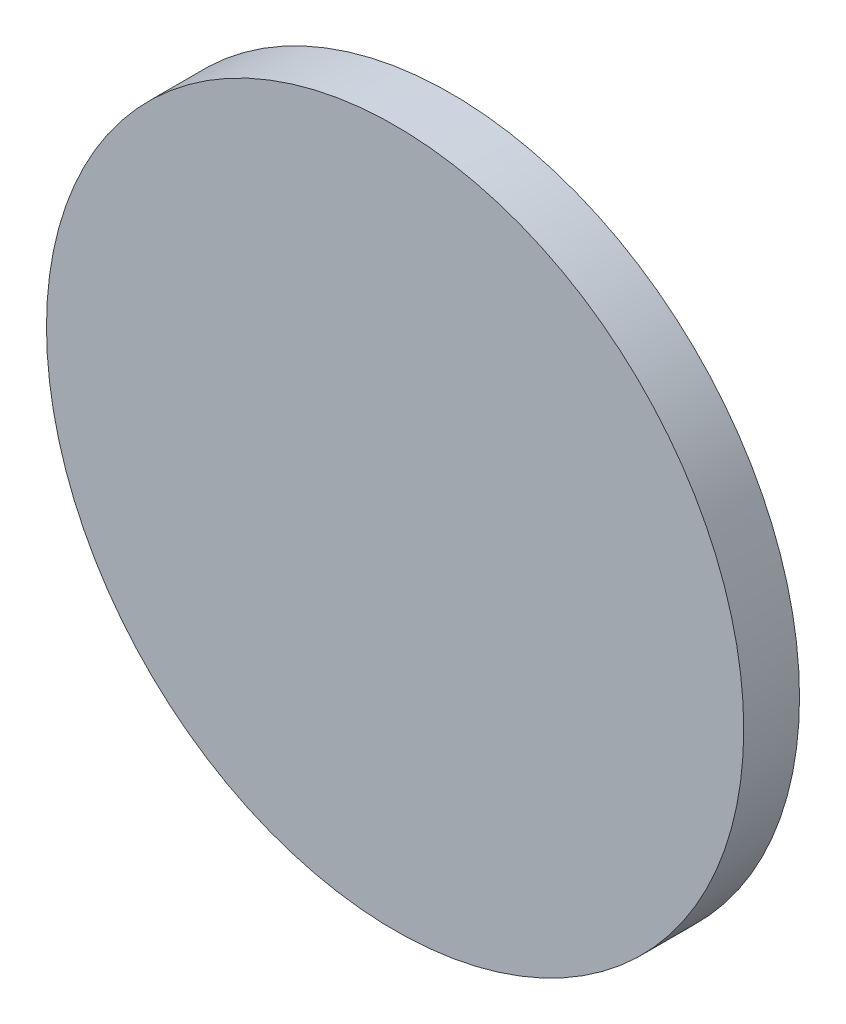
ISO-10303-21;
HEADER;
FILE_DESCRIPTION(('STEP AP214'),'2;1');
FILE_NAME('part.step','',(''),(''),'','','');
FILE_SCHEMA(('AUTOMOTIVE_DESIGN { 1 0 10303 214 1 1 1 1 }'));
ENDSEC;
DATA;
#1=APPLICATION_CONTEXT('core data for automotive mechanical design processes');
#2=APPLICATION_PROTOCOL_DEFINITION('international standard','automotive_design',2000,#1);
#3=PRODUCT_CONTEXT('',#1,'mechanical');
#4=PRODUCT('Part','Part','',(#3));
#5=PRODUCT_RELATED_PRODUCT_CATEGORY('part','',(#4));
#6=PRODUCT_DEFINITION_FORMATION('','',#4);
#7=PRODUCT_DEFINITION_CONTEXT('part definition',#1,'design');
#8=PRODUCT_DEFINITION('design','',#6,#7);
#9=PRODUCT_DEFINITION_SHAPE('','',#8);
#10=(LENGTH_UNIT() NAMED_UNIT(*) SI_UNIT(.MILLI.,.METRE.));
#11=(NAMED_UNIT(*) PLANE_ANGLE_UNIT() SI_UNIT($,.RADIAN.));
#12=(NAMED_UNIT(*) SI_UNIT($,.STERADIAN.) SOLID_ANGLE_UNIT());
#13=UNCERTAINTY_MEASURE_WITH_UNIT(LENGTH_MEASURE(1.E-05),#10,'distance_accuracy_value','');
#14=(GEOMETRIC_REPRESENTATION_CONTEXT(3) GLOBAL_UNCERTAINTY_ASSIGNED_CONTEXT((#13)) GLOBAL_UNIT_ASSIGNED_CONTEXT((#10,
#11,#12)) REPRESENTATION_CONTEXT('',''));
#15=CARTESIAN_POINT('',(0.,0.,0.));
#16=DIRECTION('',(0.,0.,1.));
#17=DIRECTION('',(1.,0.,0.));
#18=AXIS2_PLACEMENT_3D('',#15,#16,#17);
#19=CARTESIAN_POINT('',(0.,0.,1.));
#20=DIRECTION('',(0.,0.,-1.));
#21=DIRECTION('',(-1.,0.,0.));
#22=AXIS2_PLACEMENT_3D('',#19,#20,#21);
#23=CYLINDRICAL_SURFACE('',#22,6.25);
#24=CARTESIAN_POINT('',(0.,0.,1.));
#25=DIRECTION('',(0.,0.,1.));
#26=DIRECTION('',(1.,0.,0.));
#27=AXIS2_PLACEMENT_3D('',#24,#25,#26);
#28=CIRCLE('',#27,6.25);
#29=CARTESIAN_POINT('',(6.25,0.,1.));
#30=VERTEX_POINT('',#29);
#31=EDGE_CURVE('E10',#30,#30,#28,.T.);
#32=ORIENTED_EDGE('',*,*,#31,.F.);
#33=EDGE_LOOP('',(#32));
#34=FACE_BOUND('',#33,.T.);
#35=CARTESIAN_POINT('',(0.,0.,0.));
#36=DIRECTION('',(0.,0.,1.));
#37=DIRECTION('',(1.,0.,0.));
#38=AXIS2_PLACEMENT_3D('',#35,#36,#37);
#39=CIRCLE('',#38,6.25);
#40=CARTESIAN_POINT('',(6.25,0.,0.));
#41=VERTEX_POINT('',#40);
#42=EDGE_CURVE('E34',#41,#41,#39,.T.);
#43=ORIENTED_EDGE('',*,*,#42,.T.);
#44=EDGE_LOOP('',(#43));
#45=FACE_BOUND('',#44,.T.);
#46=ADVANCED_FACE('F31',(#34,#45),#23,.T.);
#47=CARTESIAN_POINT('',(0.,0.,1.));
#48=DIRECTION('',(0.,0.,1.));
#49=DIRECTION('',(1.,0.,0.));
#50=AXIS2_PLACEMENT_3D('',#47,#48,#49);
#51=PLANE('',#50);
#52=ORIENTED_EDGE('',*,*,#31,.T.);
#53=EDGE_LOOP('',(#52));
#54=FACE_BOUND('',#53,.T.);
#55=ADVANCED_FACE('F46',(#54),#51,.T.);
#56=CARTESIAN_POINT('',(0.,0.,0.));
#57=DIRECTION('',(0.,0.,1.));
#58=DIRECTION('',(1.,0.,0.));
#59=AXIS2_PLACEMENT_3D('',#56,#57,#58);
#60=PLANE('',#59);
#61=ORIENTED_EDGE('',*,*,#42,.F.);
#62=EDGE_LOOP('',(#61));
#63=FACE_BOUND('',#62,.T.);
#64=ADVANCED_FACE('F44',(#63),#60,.F.);
#65=CLOSED_SHELL('',(#46,#55,#64));
#66=MANIFOLD_SOLID_BREP('B2',#65);
#67=ADVANCED_BREP_SHAPE_REPRESENTATION('',(#18,#66),#14);
#68=SHAPE_DEFINITION_REPRESENTATION(#9,#67);
ENDSEC;
END-ISO-10303-21;
